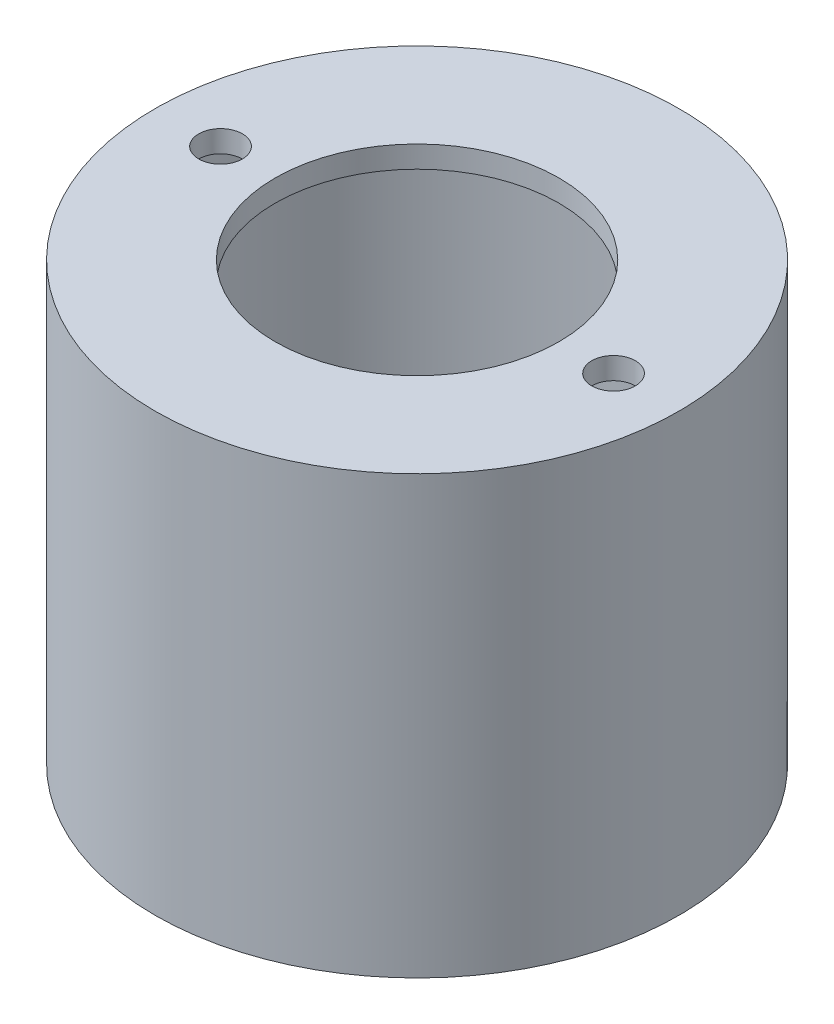
ISO-10303-21;
HEADER;
FILE_DESCRIPTION(('STEP AP214'),'2;1');
FILE_NAME('part.step','',(''),(''),'','','');
FILE_SCHEMA(('AUTOMOTIVE_DESIGN { 1 0 10303 214 1 1 1 1 }'));
ENDSEC;
DATA;
#1=APPLICATION_CONTEXT('core data for automotive mechanical design processes');
#2=APPLICATION_PROTOCOL_DEFINITION('international standard','automotive_design',2000,#1);
#3=PRODUCT_CONTEXT('',#1,'mechanical');
#4=PRODUCT('Part','Part','',(#3));
#5=PRODUCT_RELATED_PRODUCT_CATEGORY('part','',(#4));
#6=PRODUCT_DEFINITION_FORMATION('','',#4);
#7=PRODUCT_DEFINITION_CONTEXT('part definition',#1,'design');
#8=PRODUCT_DEFINITION('design','',#6,#7);
#9=PRODUCT_DEFINITION_SHAPE('','',#8);
#10=(LENGTH_UNIT() NAMED_UNIT(*) SI_UNIT(.MILLI.,.METRE.));
#11=(NAMED_UNIT(*) PLANE_ANGLE_UNIT() SI_UNIT($,.RADIAN.));
#12=(NAMED_UNIT(*) SI_UNIT($,.STERADIAN.) SOLID_ANGLE_UNIT());
#13=UNCERTAINTY_MEASURE_WITH_UNIT(LENGTH_MEASURE(1.E-05),#10,'distance_accuracy_value','');
#14=(GEOMETRIC_REPRESENTATION_CONTEXT(3) GLOBAL_UNCERTAINTY_ASSIGNED_CONTEXT((#13)) GLOBAL_UNIT_ASSIGNED_CONTEXT((#10,
#11,#12)) REPRESENTATION_CONTEXT('',''));
#15=CARTESIAN_POINT('',(0.,0.,0.));
#16=DIRECTION('',(0.,0.,1.));
#17=DIRECTION('',(1.,0.,0.));
#18=AXIS2_PLACEMENT_3D('',#15,#16,#17);
#19=CARTESIAN_POINT('',(0.,100.,0.));
#20=DIRECTION('',(0.,-1.,0.));
#21=DIRECTION('',(0.,0.,-1.));
#22=AXIS2_PLACEMENT_3D('',#19,#20,#21);
#23=CYLINDRICAL_SURFACE('',#22,60.);
#24=CARTESIAN_POINT('',(0.,100.,0.));
#25=DIRECTION('',(0.,1.,0.));
#26=DIRECTION('',(0.,0.,1.));
#27=AXIS2_PLACEMENT_3D('',#24,#25,#26);
#28=CIRCLE('',#27,60.);
#29=CARTESIAN_POINT('',(0.,100.,60.));
#30=VERTEX_POINT('',#29);
#31=EDGE_CURVE('E10',#30,#30,#28,.T.);
#32=ORIENTED_EDGE('',*,*,#31,.F.);
#33=EDGE_LOOP('',(#32));
#34=FACE_BOUND('',#33,.T.);
#35=CARTESIAN_POINT('',(0.,0.,0.));
#36=DIRECTION('',(0.,1.,0.));
#37=DIRECTION('',(0.,0.,1.));
#38=AXIS2_PLACEMENT_3D('',#35,#36,#37);
#39=CIRCLE('',#38,60.);
#40=CARTESIAN_POINT('',(0.,0.,60.));
#41=VERTEX_POINT('',#40);
#42=EDGE_CURVE('E51',#41,#41,#39,.T.);
#43=ORIENTED_EDGE('',*,*,#42,.T.);
#44=EDGE_LOOP('',(#43));
#45=FACE_BOUND('',#44,.T.);
#46=ADVANCED_FACE('F43',(#34,#45),#23,.T.);
#47=CARTESIAN_POINT('',(0.,100.,0.));
#48=DIRECTION('',(0.,1.,0.));
#49=DIRECTION('',(0.,0.,1.));
#50=AXIS2_PLACEMENT_3D('',#47,#48,#49);
#51=PLANE('',#50);
#52=CARTESIAN_POINT('',(45.,100.,0.));
#53=DIRECTION('',(0.,1.,0.));
#54=DIRECTION('',(0.,0.,1.));
#55=AXIS2_PLACEMENT_3D('',#52,#53,#54);
#56=CIRCLE('',#55,5.);
#57=CARTESIAN_POINT('',(45.,100.,5.));
#58=VERTEX_POINT('',#57);
#59=EDGE_CURVE('E70',#58,#58,#56,.T.);
#60=ORIENTED_EDGE('',*,*,#59,.F.);
#61=EDGE_LOOP('',(#60));
#62=FACE_BOUND('',#61,.T.);
#63=CARTESIAN_POINT('',(-45.,100.,0.));
#64=DIRECTION('',(0.,1.,0.));
#65=DIRECTION('',(0.,0.,-1.));
#66=AXIS2_PLACEMENT_3D('',#63,#64,#65);
#67=CIRCLE('',#66,5.);
#68=CARTESIAN_POINT('',(-45.,100.,-5.));
#69=VERTEX_POINT('',#68);
#70=EDGE_CURVE('E77',#69,#69,#67,.T.);
#71=ORIENTED_EDGE('',*,*,#70,.F.);
#72=EDGE_LOOP('',(#71));
#73=FACE_BOUND('',#72,.T.);
#74=CARTESIAN_POINT('',(0.,100.,0.));
#75=DIRECTION('',(0.,1.,0.));
#76=DIRECTION('',(0.,0.,1.));
#77=AXIS2_PLACEMENT_3D('',#74,#75,#76);
#78=CIRCLE('',#77,32.5);
#79=CARTESIAN_POINT('',(0.,100.,32.5));
#80=VERTEX_POINT('',#79);
#81=EDGE_CURVE('E66',#80,#80,#78,.T.);
#82=ORIENTED_EDGE('',*,*,#81,.F.);
#83=EDGE_LOOP('',(#82));
#84=FACE_BOUND('',#83,.T.);
#85=ORIENTED_EDGE('',*,*,#31,.T.);
#86=EDGE_LOOP('',(#85));
#87=FACE_BOUND('',#86,.T.);
#88=ADVANCED_FACE('F110',(#62,#73,#84,#87),#51,.T.);
#89=CARTESIAN_POINT('',(0.,0.,0.));
#90=DIRECTION('',(0.,1.,0.));
#91=DIRECTION('',(0.,0.,1.));
#92=AXIS2_PLACEMENT_3D('',#89,#90,#91);
#93=PLANE('',#92);
#94=CARTESIAN_POINT('',(0.,0.,0.));
#95=DIRECTION('',(0.,1.,0.));
#96=DIRECTION('',(0.,0.,1.));
#97=AXIS2_PLACEMENT_3D('',#94,#95,#96);
#98=CIRCLE('',#97,55.);
#99=CARTESIAN_POINT('',(0.,0.,55.));
#100=VERTEX_POINT('',#99);
#101=EDGE_CURVE('E60',#100,#100,#98,.T.);
#102=ORIENTED_EDGE('',*,*,#101,.T.);
#103=EDGE_LOOP('',(#102));
#104=FACE_BOUND('',#103,.T.);
#105=ORIENTED_EDGE('',*,*,#42,.F.);
#106=EDGE_LOOP('',(#105));
#107=FACE_BOUND('',#106,.T.);
#108=ADVANCED_FACE('F95',(#104,#107),#93,.F.);
#109=CARTESIAN_POINT('',(0.,100.,0.));
#110=DIRECTION('',(0.,-1.,0.));
#111=DIRECTION('',(0.,0.,-1.));
#112=AXIS2_PLACEMENT_3D('',#109,#110,#111);
#113=CYLINDRICAL_SURFACE('',#112,55.);
#114=CARTESIAN_POINT('',(0.,95.,0.));
#115=DIRECTION('',(0.,1.,0.));
#116=DIRECTION('',(0.,0.,1.));
#117=AXIS2_PLACEMENT_3D('',#114,#115,#116);
#118=CIRCLE('',#117,55.);
#119=CARTESIAN_POINT('',(0.,95.,55.));
#120=VERTEX_POINT('',#119);
#121=EDGE_CURVE('E57',#120,#120,#118,.T.);
#122=ORIENTED_EDGE('',*,*,#121,.T.);
#123=EDGE_LOOP('',(#122));
#124=FACE_BOUND('',#123,.T.);
#125=ORIENTED_EDGE('',*,*,#101,.F.);
#126=EDGE_LOOP('',(#125));
#127=FACE_BOUND('',#126,.T.);
#128=ADVANCED_FACE('F98',(#124,#127),#113,.F.);
#129=CARTESIAN_POINT('',(0.,95.,0.));
#130=DIRECTION('',(0.,1.,0.));
#131=DIRECTION('',(0.,0.,1.));
#132=AXIS2_PLACEMENT_3D('',#129,#130,#131);
#133=PLANE('',#132);
#134=CARTESIAN_POINT('',(45.,95.,0.));
#135=DIRECTION('',(0.,1.,0.));
#136=DIRECTION('',(0.,0.,1.));
#137=AXIS2_PLACEMENT_3D('',#134,#135,#136);
#138=CIRCLE('',#137,5.);
#139=CARTESIAN_POINT('',(45.,95.,5.));
#140=VERTEX_POINT('',#139);
#141=EDGE_CURVE('E46',#140,#140,#138,.T.);
#142=ORIENTED_EDGE('',*,*,#141,.T.);
#143=EDGE_LOOP('',(#142));
#144=FACE_BOUND('',#143,.T.);
#145=CARTESIAN_POINT('',(-45.,95.,0.));
#146=DIRECTION('',(0.,1.,0.));
#147=DIRECTION('',(0.,0.,1.));
#148=AXIS2_PLACEMENT_3D('',#145,#146,#147);
#149=CIRCLE('',#148,5.);
#150=CARTESIAN_POINT('',(-45.,95.,5.));
#151=VERTEX_POINT('',#150);
#152=EDGE_CURVE('E67',#151,#151,#149,.T.);
#153=ORIENTED_EDGE('',*,*,#152,.T.);
#154=EDGE_LOOP('',(#153));
#155=FACE_BOUND('',#154,.T.);
#156=CARTESIAN_POINT('',(0.,95.,0.));
#157=DIRECTION('',(0.,1.,0.));
#158=DIRECTION('',(0.,0.,1.));
#159=AXIS2_PLACEMENT_3D('',#156,#157,#158);
#160=CIRCLE('',#159,32.5);
#161=CARTESIAN_POINT('',(0.,95.,32.5));
#162=VERTEX_POINT('',#161);
#163=EDGE_CURVE('E63',#162,#162,#160,.T.);
#164=ORIENTED_EDGE('',*,*,#163,.T.);
#165=EDGE_LOOP('',(#164));
#166=FACE_BOUND('',#165,.T.);
#167=ORIENTED_EDGE('',*,*,#121,.F.);
#168=EDGE_LOOP('',(#167));
#169=FACE_BOUND('',#168,.T.);
#170=ADVANCED_FACE('F100',(#144,#155,#166,#169),#133,.F.);
#171=CARTESIAN_POINT('',(0.,0.,0.));
#172=DIRECTION('',(0.,1.,0.));
#173=DIRECTION('',(0.,0.,1.));
#174=AXIS2_PLACEMENT_3D('',#171,#172,#173);
#175=CYLINDRICAL_SURFACE('',#174,32.5);
#176=ORIENTED_EDGE('',*,*,#81,.T.);
#177=EDGE_LOOP('',(#176));
#178=FACE_BOUND('',#177,.T.);
#179=ORIENTED_EDGE('',*,*,#163,.F.);
#180=EDGE_LOOP('',(#179));
#181=FACE_BOUND('',#180,.T.);
#182=ADVANCED_FACE('F107',(#178,#181),#175,.F.);
#183=CARTESIAN_POINT('',(-45.,0.,0.));
#184=DIRECTION('',(0.,1.,0.));
#185=DIRECTION('',(0.,0.,1.));
#186=AXIS2_PLACEMENT_3D('',#183,#184,#185);
#187=CYLINDRICAL_SURFACE('',#186,5.);
#188=ORIENTED_EDGE('',*,*,#70,.T.);
#189=EDGE_LOOP('',(#188));
#190=FACE_BOUND('',#189,.T.);
#191=ORIENTED_EDGE('',*,*,#152,.F.);
#192=EDGE_LOOP('',(#191));
#193=FACE_BOUND('',#192,.T.);
#194=ADVANCED_FACE('F129',(#190,#193),#187,.F.);
#195=CARTESIAN_POINT('',(45.,0.,0.));
#196=DIRECTION('',(0.,1.,0.));
#197=DIRECTION('',(0.,0.,1.));
#198=AXIS2_PLACEMENT_3D('',#195,#196,#197);
#199=CYLINDRICAL_SURFACE('',#198,5.);
#200=ORIENTED_EDGE('',*,*,#59,.T.);
#201=EDGE_LOOP('',(#200));
#202=FACE_BOUND('',#201,.T.);
#203=ORIENTED_EDGE('',*,*,#141,.F.);
#204=EDGE_LOOP('',(#203));
#205=FACE_BOUND('',#204,.T.);
#206=ADVANCED_FACE('F136',(#202,#205),#199,.F.);
#207=CLOSED_SHELL('',(#46,#88,#108,#128,#170,#182,#194,#206));
#208=MANIFOLD_SOLID_BREP('B2',#207);
#209=ADVANCED_BREP_SHAPE_REPRESENTATION('',(#18,#208),#14);
#210=SHAPE_DEFINITION_REPRESENTATION(#9,#209);
ENDSEC;
END-ISO-10303-21;
